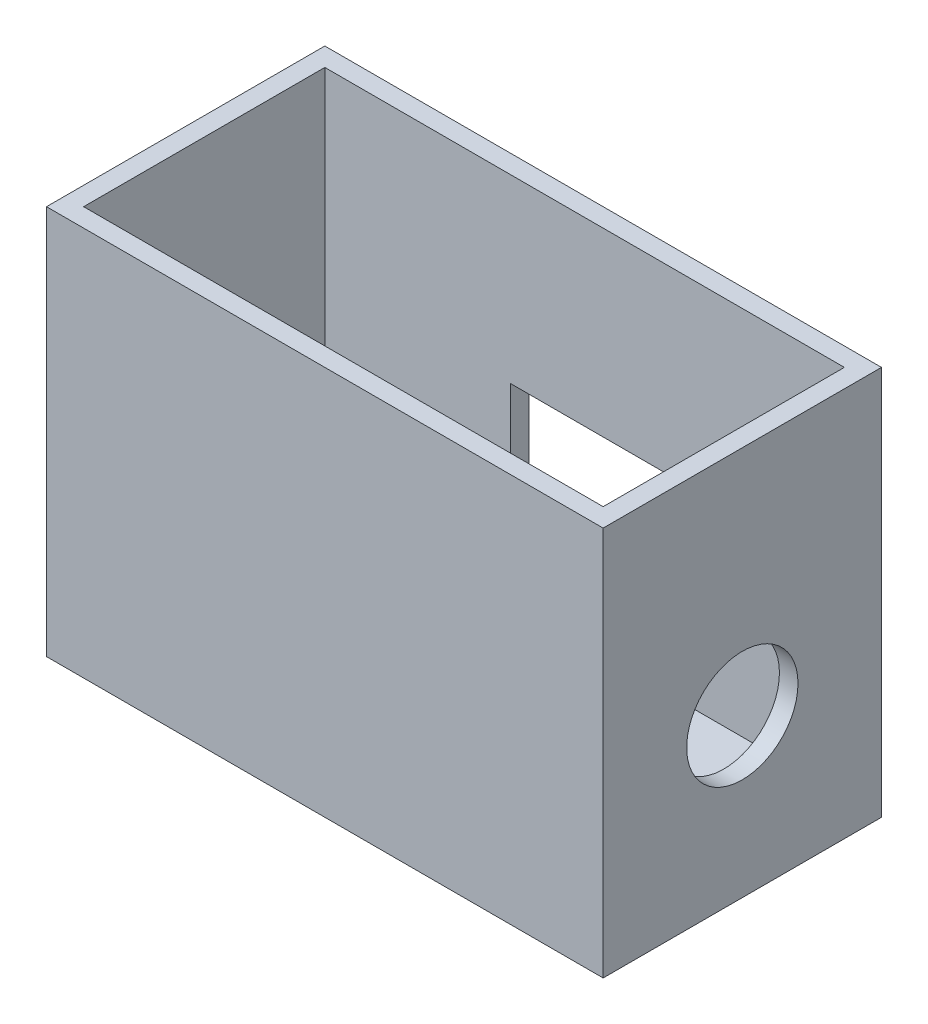
ISO-10303-21;
HEADER;
FILE_DESCRIPTION(('STEP AP214'),'2;1');
FILE_NAME('part.step','',(''),(''),'','','');
FILE_SCHEMA(('AUTOMOTIVE_DESIGN { 1 0 10303 214 1 1 1 1 }'));
ENDSEC;
DATA;
#1=APPLICATION_CONTEXT('core data for automotive mechanical design processes');
#2=APPLICATION_PROTOCOL_DEFINITION('international standard','automotive_design',2000,#1);
#3=PRODUCT_CONTEXT('',#1,'mechanical');
#4=PRODUCT('Part','Part','',(#3));
#5=PRODUCT_RELATED_PRODUCT_CATEGORY('part','',(#4));
#6=PRODUCT_DEFINITION_FORMATION('','',#4);
#7=PRODUCT_DEFINITION_CONTEXT('part definition',#1,'design');
#8=PRODUCT_DEFINITION('design','',#6,#7);
#9=PRODUCT_DEFINITION_SHAPE('','',#8);
#10=(LENGTH_UNIT() NAMED_UNIT(*) SI_UNIT(.MILLI.,.METRE.));
#11=(NAMED_UNIT(*) PLANE_ANGLE_UNIT() SI_UNIT($,.RADIAN.));
#12=(NAMED_UNIT(*) SI_UNIT($,.STERADIAN.) SOLID_ANGLE_UNIT());
#13=UNCERTAINTY_MEASURE_WITH_UNIT(LENGTH_MEASURE(1.E-05),#10,'distance_accuracy_value','');
#14=(GEOMETRIC_REPRESENTATION_CONTEXT(3) GLOBAL_UNCERTAINTY_ASSIGNED_CONTEXT((#13)) GLOBAL_UNIT_ASSIGNED_CONTEXT((#10,
#11,#12)) REPRESENTATION_CONTEXT('',''));
#15=CARTESIAN_POINT('',(0.,0.,0.));
#16=DIRECTION('',(0.,0.,1.));
#17=DIRECTION('',(1.,0.,0.));
#18=AXIS2_PLACEMENT_3D('',#15,#16,#17);
#19=CARTESIAN_POINT('',(0.,42.,2.));
#20=DIRECTION('',(0.,0.,-1.));
#21=DIRECTION('',(-1.,0.,0.));
#22=AXIS2_PLACEMENT_3D('',#19,#20,#21);
#23=PLANE('',#22);
#24=DIRECTION('',(-1.,0.,0.));
#25=VECTOR('',#24,1.);
#26=CARTESIAN_POINT('',(40.,22.5,2.));
#27=LINE('',#26,#25);
#28=CARTESIAN_POINT('',(40.,22.5,2.));
#29=VERTEX_POINT('',#28);
#30=CARTESIAN_POINT('',(22.,22.5,2.));
#31=VERTEX_POINT('',#30);
#32=EDGE_CURVE('E134',#29,#31,#27,.T.);
#33=ORIENTED_EDGE('',*,*,#32,.F.);
#34=DIRECTION('',(0.,1.,0.));
#35=VECTOR('',#34,1.);
#36=CARTESIAN_POINT('',(40.,22.5,2.));
#37=LINE('',#36,#35);
#38=CARTESIAN_POINT('',(40.,10.,2.));
#39=VERTEX_POINT('',#38);
#40=EDGE_CURVE('E136',#39,#29,#37,.T.);
#41=ORIENTED_EDGE('',*,*,#40,.F.);
#42=DIRECTION('',(1.,0.,0.));
#43=VECTOR('',#42,1.);
#44=CARTESIAN_POINT('',(40.,10.,2.));
#45=LINE('',#44,#43);
#46=CARTESIAN_POINT('',(22.,10.,2.));
#47=VERTEX_POINT('',#46);
#48=EDGE_CURVE('E145',#47,#39,#45,.T.);
#49=ORIENTED_EDGE('',*,*,#48,.F.);
#50=DIRECTION('',(0.,-1.,0.));
#51=VECTOR('',#50,1.);
#52=CARTESIAN_POINT('',(22.,22.5,2.));
#53=LINE('',#52,#51);
#54=EDGE_CURVE('E53',#31,#47,#53,.T.);
#55=ORIENTED_EDGE('',*,*,#54,.F.);
#56=EDGE_LOOP('',(#33,#41,#49,#55));
#57=FACE_BOUND('',#56,.T.);
#58=DIRECTION('',(0.,-1.,0.));
#59=VECTOR('',#58,1.);
#60=CARTESIAN_POINT('',(58.,42.,2.));
#61=LINE('',#60,#59);
#62=CARTESIAN_POINT('',(58.,42.,2.));
#63=VERTEX_POINT('',#62);
#64=CARTESIAN_POINT('',(58.,2.,2.));
#65=VERTEX_POINT('',#64);
#66=EDGE_CURVE('E166',#63,#65,#61,.T.);
#67=ORIENTED_EDGE('',*,*,#66,.F.);
#68=DIRECTION('',(1.,0.,0.));
#69=VECTOR('',#68,1.);
#70=CARTESIAN_POINT('',(0.,42.,2.));
#71=LINE('',#70,#69);
#72=CARTESIAN_POINT('',(2.,42.,2.));
#73=VERTEX_POINT('',#72);
#74=EDGE_CURVE('E194',#73,#63,#71,.T.);
#75=ORIENTED_EDGE('',*,*,#74,.F.);
#76=DIRECTION('',(0.,-1.,0.));
#77=VECTOR('',#76,1.);
#78=CARTESIAN_POINT('',(2.,42.,2.));
#79=LINE('',#78,#77);
#80=CARTESIAN_POINT('',(2.,2.,2.));
#81=VERTEX_POINT('',#80);
#82=EDGE_CURVE('E177',#73,#81,#79,.T.);
#83=ORIENTED_EDGE('',*,*,#82,.T.);
#84=DIRECTION('',(1.,0.,0.));
#85=VECTOR('',#84,1.);
#86=CARTESIAN_POINT('',(0.,2.,2.));
#87=LINE('',#86,#85);
#88=EDGE_CURVE('E190',#81,#65,#87,.T.);
#89=ORIENTED_EDGE('',*,*,#88,.T.);
#90=EDGE_LOOP('',(#67,#75,#83,#89));
#91=FACE_BOUND('',#90,.T.);
#92=ADVANCED_FACE('F39',(#57,#91),#23,.F.);
#93=CARTESIAN_POINT('',(0.,42.,28.));
#94=DIRECTION('',(0.,0.,1.));
#95=DIRECTION('',(1.,0.,0.));
#96=AXIS2_PLACEMENT_3D('',#93,#94,#95);
#97=PLANE('',#96);
#98=DIRECTION('',(-1.,0.,0.));
#99=VECTOR('',#98,1.);
#100=CARTESIAN_POINT('',(0.,42.,28.));
#101=LINE('',#100,#99);
#102=CARTESIAN_POINT('',(58.,42.,28.));
#103=VERTEX_POINT('',#102);
#104=CARTESIAN_POINT('',(2.,42.,28.));
#105=VERTEX_POINT('',#104);
#106=EDGE_CURVE('E189',#103,#105,#101,.T.);
#107=ORIENTED_EDGE('',*,*,#106,.F.);
#108=DIRECTION('',(0.,-1.,0.));
#109=VECTOR('',#108,1.);
#110=CARTESIAN_POINT('',(58.,42.,28.));
#111=LINE('',#110,#109);
#112=CARTESIAN_POINT('',(58.,2.,28.));
#113=VERTEX_POINT('',#112);
#114=EDGE_CURVE('E164',#103,#113,#111,.T.);
#115=ORIENTED_EDGE('',*,*,#114,.T.);
#116=DIRECTION('',(-1.,0.,0.));
#117=VECTOR('',#116,1.);
#118=CARTESIAN_POINT('',(0.,2.,28.));
#119=LINE('',#118,#117);
#120=CARTESIAN_POINT('',(2.,2.,28.));
#121=VERTEX_POINT('',#120);
#122=EDGE_CURVE('E181',#113,#121,#119,.T.);
#123=ORIENTED_EDGE('',*,*,#122,.T.);
#124=DIRECTION('',(0.,-1.,0.));
#125=VECTOR('',#124,1.);
#126=CARTESIAN_POINT('',(2.,42.,28.));
#127=LINE('',#126,#125);
#128=EDGE_CURVE('E178',#105,#121,#127,.T.);
#129=ORIENTED_EDGE('',*,*,#128,.F.);
#130=EDGE_LOOP('',(#107,#115,#123,#129));
#131=FACE_BOUND('',#130,.T.);
#132=ADVANCED_FACE('F241',(#131),#97,.F.);
#133=CARTESIAN_POINT('',(0.,2.,0.));
#134=DIRECTION('',(1.,0.,0.));
#135=DIRECTION('',(0.,0.,-1.));
#136=AXIS2_PLACEMENT_3D('',#133,#134,#135);
#137=PLANE('',#136);
#138=DIRECTION('',(0.,-1.,0.));
#139=VECTOR('',#138,1.);
#140=CARTESIAN_POINT('',(0.,2.,30.));
#141=LINE('',#140,#139);
#142=CARTESIAN_POINT('',(0.,42.,30.));
#143=VERTEX_POINT('',#142);
#144=CARTESIAN_POINT('',(0.,0.,30.));
#145=VERTEX_POINT('',#144);
#146=EDGE_CURVE('E11',#143,#145,#141,.T.);
#147=ORIENTED_EDGE('',*,*,#146,.F.);
#148=DIRECTION('',(0.,0.,1.));
#149=VECTOR('',#148,1.);
#150=CARTESIAN_POINT('',(0.,42.,0.));
#151=LINE('',#150,#149);
#152=CARTESIAN_POINT('',(0.,42.,0.));
#153=VERTEX_POINT('',#152);
#154=EDGE_CURVE('E192',#153,#143,#151,.T.);
#155=ORIENTED_EDGE('',*,*,#154,.F.);
#156=DIRECTION('',(0.,-1.,0.));
#157=VECTOR('',#156,1.);
#158=CARTESIAN_POINT('',(0.,2.,0.));
#159=LINE('',#158,#157);
#160=CARTESIAN_POINT('',(0.,0.,0.));
#161=VERTEX_POINT('',#160);
#162=EDGE_CURVE('E211',#153,#161,#159,.T.);
#163=ORIENTED_EDGE('',*,*,#162,.T.);
#164=DIRECTION('',(0.,0.,1.));
#165=VECTOR('',#164,1.);
#166=CARTESIAN_POINT('',(0.,0.,0.));
#167=LINE('',#166,#165);
#168=EDGE_CURVE('E203',#161,#145,#167,.T.);
#169=ORIENTED_EDGE('',*,*,#168,.T.);
#170=EDGE_LOOP('',(#147,#155,#163,#169));
#171=FACE_BOUND('',#170,.T.);
#172=ADVANCED_FACE('F41',(#171),#137,.F.);
#173=CARTESIAN_POINT('',(0.,2.,30.));
#174=DIRECTION('',(0.,0.,-1.));
#175=DIRECTION('',(-1.,0.,0.));
#176=AXIS2_PLACEMENT_3D('',#173,#174,#175);
#177=PLANE('',#176);
#178=DIRECTION('',(1.,0.,0.));
#179=VECTOR('',#178,1.);
#180=CARTESIAN_POINT('',(0.,0.,30.));
#181=LINE('',#180,#179);
#182=CARTESIAN_POINT('',(60.,0.,30.));
#183=VERTEX_POINT('',#182);
#184=EDGE_CURVE('E202',#145,#183,#181,.T.);
#185=ORIENTED_EDGE('',*,*,#184,.T.);
#186=DIRECTION('',(0.,-1.,0.));
#187=VECTOR('',#186,1.);
#188=CARTESIAN_POINT('',(60.,2.,30.));
#189=LINE('',#188,#187);
#190=CARTESIAN_POINT('',(60.,42.,30.));
#191=VERTEX_POINT('',#190);
#192=EDGE_CURVE('E50',#191,#183,#189,.T.);
#193=ORIENTED_EDGE('',*,*,#192,.F.);
#194=DIRECTION('',(1.,0.,0.));
#195=VECTOR('',#194,1.);
#196=CARTESIAN_POINT('',(0.,42.,30.));
#197=LINE('',#196,#195);
#198=EDGE_CURVE('E184',#143,#191,#197,.T.);
#199=ORIENTED_EDGE('',*,*,#198,.F.);
#200=ORIENTED_EDGE('',*,*,#146,.T.);
#201=EDGE_LOOP('',(#185,#193,#199,#200));
#202=FACE_BOUND('',#201,.T.);
#203=ADVANCED_FACE('F237',(#202),#177,.F.);
#204=CARTESIAN_POINT('',(60.,2.,0.));
#205=DIRECTION('',(-1.,0.,0.));
#206=DIRECTION('',(0.,0.,1.));
#207=AXIS2_PLACEMENT_3D('',#204,#205,#206);
#208=PLANE('',#207);
#209=CARTESIAN_POINT('',(60.,17.,15.));
#210=DIRECTION('',(1.,0.,0.));
#211=DIRECTION('',(0.,0.,-1.));
#212=AXIS2_PLACEMENT_3D('',#209,#210,#211);
#213=CIRCLE('',#212,6.);
#214=CARTESIAN_POINT('',(60.,17.,9.));
#215=VERTEX_POINT('',#214);
#216=EDGE_CURVE('E158',#215,#215,#213,.T.);
#217=ORIENTED_EDGE('',*,*,#216,.F.);
#218=EDGE_LOOP('',(#217));
#219=FACE_BOUND('',#218,.T.);
#220=DIRECTION('',(0.,0.,-1.));
#221=VECTOR('',#220,1.);
#222=CARTESIAN_POINT('',(60.,0.,0.));
#223=LINE('',#222,#221);
#224=CARTESIAN_POINT('',(60.,0.,0.));
#225=VERTEX_POINT('',#224);
#226=EDGE_CURVE('E210',#183,#225,#223,.T.);
#227=ORIENTED_EDGE('',*,*,#226,.T.);
#228=DIRECTION('',(0.,-1.,0.));
#229=VECTOR('',#228,1.);
#230=CARTESIAN_POINT('',(60.,2.,0.));
#231=LINE('',#230,#229);
#232=CARTESIAN_POINT('',(60.,42.,0.));
#233=VERTEX_POINT('',#232);
#234=EDGE_CURVE('E212',#233,#225,#231,.T.);
#235=ORIENTED_EDGE('',*,*,#234,.F.);
#236=DIRECTION('',(0.,0.,1.));
#237=VECTOR('',#236,1.);
#238=CARTESIAN_POINT('',(60.,42.,0.));
#239=LINE('',#238,#237);
#240=EDGE_CURVE('E198',#233,#191,#239,.T.);
#241=ORIENTED_EDGE('',*,*,#240,.T.);
#242=ORIENTED_EDGE('',*,*,#192,.T.);
#243=EDGE_LOOP('',(#227,#235,#241,#242));
#244=FACE_BOUND('',#243,.T.);
#245=ADVANCED_FACE('F219',(#219,#244),#208,.F.);
#246=CARTESIAN_POINT('',(0.,2.,0.));
#247=DIRECTION('',(0.,0.,1.));
#248=DIRECTION('',(1.,0.,0.));
#249=AXIS2_PLACEMENT_3D('',#246,#247,#248);
#250=PLANE('',#249);
#251=DIRECTION('',(-1.,0.,0.));
#252=VECTOR('',#251,1.);
#253=CARTESIAN_POINT('',(40.,10.,0.));
#254=LINE('',#253,#252);
#255=CARTESIAN_POINT('',(40.,10.,0.));
#256=VERTEX_POINT('',#255);
#257=CARTESIAN_POINT('',(22.,10.,0.));
#258=VERTEX_POINT('',#257);
#259=EDGE_CURVE('E267',#256,#258,#254,.T.);
#260=ORIENTED_EDGE('',*,*,#259,.F.);
#261=DIRECTION('',(0.,-1.,0.));
#262=VECTOR('',#261,1.);
#263=CARTESIAN_POINT('',(40.,22.5,0.));
#264=LINE('',#263,#262);
#265=CARTESIAN_POINT('',(40.,22.5,0.));
#266=VERTEX_POINT('',#265);
#267=EDGE_CURVE('E64',#266,#256,#264,.T.);
#268=ORIENTED_EDGE('',*,*,#267,.F.);
#269=DIRECTION('',(1.,0.,0.));
#270=VECTOR('',#269,1.);
#271=CARTESIAN_POINT('',(40.,22.5,0.));
#272=LINE('',#271,#270);
#273=CARTESIAN_POINT('',(22.,22.5,0.));
#274=VERTEX_POINT('',#273);
#275=EDGE_CURVE('E135',#274,#266,#272,.T.);
#276=ORIENTED_EDGE('',*,*,#275,.F.);
#277=DIRECTION('',(0.,1.,0.));
#278=VECTOR('',#277,1.);
#279=CARTESIAN_POINT('',(22.,22.5,0.));
#280=LINE('',#279,#278);
#281=EDGE_CURVE('E271',#258,#274,#280,.T.);
#282=ORIENTED_EDGE('',*,*,#281,.F.);
#283=EDGE_LOOP('',(#260,#268,#276,#282));
#284=FACE_BOUND('',#283,.T.);
#285=DIRECTION('',(-1.,0.,0.));
#286=VECTOR('',#285,1.);
#287=CARTESIAN_POINT('',(0.,0.,0.));
#288=LINE('',#287,#286);
#289=EDGE_CURVE('E207',#225,#161,#288,.T.);
#290=ORIENTED_EDGE('',*,*,#289,.T.);
#291=ORIENTED_EDGE('',*,*,#162,.F.);
#292=DIRECTION('',(1.,0.,0.));
#293=VECTOR('',#292,1.);
#294=CARTESIAN_POINT('',(0.,42.,0.));
#295=LINE('',#294,#293);
#296=EDGE_CURVE('E196',#153,#233,#295,.T.);
#297=ORIENTED_EDGE('',*,*,#296,.T.);
#298=ORIENTED_EDGE('',*,*,#234,.T.);
#299=EDGE_LOOP('',(#290,#291,#297,#298));
#300=FACE_BOUND('',#299,.T.);
#301=ADVANCED_FACE('F230',(#284,#300),#250,.F.);
#302=CARTESIAN_POINT('',(0.,2.,0.));
#303=DIRECTION('',(0.,1.,0.));
#304=DIRECTION('',(0.,0.,1.));
#305=AXIS2_PLACEMENT_3D('',#302,#303,#304);
#306=PLANE('',#305);
#307=DIRECTION('',(0.,0.,1.));
#308=VECTOR('',#307,1.);
#309=CARTESIAN_POINT('',(58.,2.,2.));
#310=LINE('',#309,#308);
#311=EDGE_CURVE('E161',#65,#113,#310,.T.);
#312=ORIENTED_EDGE('',*,*,#311,.F.);
#313=ORIENTED_EDGE('',*,*,#88,.F.);
#314=DIRECTION('',(0.,0.,-1.));
#315=VECTOR('',#314,1.);
#316=CARTESIAN_POINT('',(2.,2.,2.));
#317=LINE('',#316,#315);
#318=EDGE_CURVE('E174',#121,#81,#317,.T.);
#319=ORIENTED_EDGE('',*,*,#318,.F.);
#320=ORIENTED_EDGE('',*,*,#122,.F.);
#321=EDGE_LOOP('',(#312,#313,#319,#320));
#322=FACE_BOUND('',#321,.T.);
#323=ADVANCED_FACE('F260',(#322),#306,.T.);
#324=CARTESIAN_POINT('',(0.,0.,0.));
#325=DIRECTION('',(0.,1.,0.));
#326=DIRECTION('',(0.,0.,1.));
#327=AXIS2_PLACEMENT_3D('',#324,#325,#326);
#328=PLANE('',#327);
#329=ORIENTED_EDGE('',*,*,#168,.F.);
#330=ORIENTED_EDGE('',*,*,#289,.F.);
#331=ORIENTED_EDGE('',*,*,#226,.F.);
#332=ORIENTED_EDGE('',*,*,#184,.F.);
#333=EDGE_LOOP('',(#329,#330,#331,#332));
#334=FACE_BOUND('',#333,.T.);
#335=ADVANCED_FACE('F229',(#334),#328,.F.);
#336=CARTESIAN_POINT('',(0.,42.,0.));
#337=DIRECTION('',(0.,1.,0.));
#338=DIRECTION('',(0.,0.,1.));
#339=AXIS2_PLACEMENT_3D('',#336,#337,#338);
#340=PLANE('',#339);
#341=DIRECTION('',(0.,0.,1.));
#342=VECTOR('',#341,1.);
#343=CARTESIAN_POINT('',(58.,42.,2.));
#344=LINE('',#343,#342);
#345=EDGE_CURVE('E165',#63,#103,#344,.T.);
#346=ORIENTED_EDGE('',*,*,#345,.T.);
#347=ORIENTED_EDGE('',*,*,#106,.T.);
#348=DIRECTION('',(0.,0.,-1.));
#349=VECTOR('',#348,1.);
#350=CARTESIAN_POINT('',(2.,42.,2.));
#351=LINE('',#350,#349);
#352=EDGE_CURVE('E172',#105,#73,#351,.T.);
#353=ORIENTED_EDGE('',*,*,#352,.T.);
#354=ORIENTED_EDGE('',*,*,#74,.T.);
#355=EDGE_LOOP('',(#346,#347,#353,#354));
#356=FACE_BOUND('',#355,.T.);
#357=ORIENTED_EDGE('',*,*,#154,.T.);
#358=ORIENTED_EDGE('',*,*,#198,.T.);
#359=ORIENTED_EDGE('',*,*,#240,.F.);
#360=ORIENTED_EDGE('',*,*,#296,.F.);
#361=EDGE_LOOP('',(#357,#358,#359,#360));
#362=FACE_BOUND('',#361,.T.);
#363=ADVANCED_FACE('F233',(#356,#362),#340,.T.);
#364=CARTESIAN_POINT('',(2.,42.,2.));
#365=DIRECTION('',(-1.,0.,0.));
#366=DIRECTION('',(0.,0.,1.));
#367=AXIS2_PLACEMENT_3D('',#364,#365,#366);
#368=PLANE('',#367);
#369=ORIENTED_EDGE('',*,*,#318,.T.);
#370=ORIENTED_EDGE('',*,*,#82,.F.);
#371=ORIENTED_EDGE('',*,*,#352,.F.);
#372=ORIENTED_EDGE('',*,*,#128,.T.);
#373=EDGE_LOOP('',(#369,#370,#371,#372));
#374=FACE_BOUND('',#373,.T.);
#375=ADVANCED_FACE('F293',(#374),#368,.F.);
#376=CARTESIAN_POINT('',(58.,42.,2.));
#377=DIRECTION('',(1.,0.,0.));
#378=DIRECTION('',(0.,0.,-1.));
#379=AXIS2_PLACEMENT_3D('',#376,#377,#378);
#380=PLANE('',#379);
#381=CARTESIAN_POINT('',(58.,17.,15.));
#382=DIRECTION('',(1.,0.,0.));
#383=DIRECTION('',(0.,0.,-1.));
#384=AXIS2_PLACEMENT_3D('',#381,#382,#383);
#385=CIRCLE('',#384,6.);
#386=CARTESIAN_POINT('',(58.,17.,9.));
#387=VERTEX_POINT('',#386);
#388=EDGE_CURVE('E146',#387,#387,#385,.F.);
#389=ORIENTED_EDGE('',*,*,#388,.F.);
#390=EDGE_LOOP('',(#389));
#391=FACE_BOUND('',#390,.T.);
#392=ORIENTED_EDGE('',*,*,#311,.T.);
#393=ORIENTED_EDGE('',*,*,#114,.F.);
#394=ORIENTED_EDGE('',*,*,#345,.F.);
#395=ORIENTED_EDGE('',*,*,#66,.T.);
#396=EDGE_LOOP('',(#392,#393,#394,#395));
#397=FACE_BOUND('',#396,.T.);
#398=ADVANCED_FACE('F292',(#391,#397),#380,.F.);
#399=CARTESIAN_POINT('',(-0.00100000000000794,17.,15.));
#400=DIRECTION('',(1.,0.,0.));
#401=DIRECTION('',(0.,0.,-1.));
#402=AXIS2_PLACEMENT_3D('',#399,#400,#401);
#403=CYLINDRICAL_SURFACE('',#402,6.);
#404=ORIENTED_EDGE('',*,*,#216,.T.);
#405=EDGE_LOOP('',(#404));
#406=FACE_BOUND('',#405,.T.);
#407=ORIENTED_EDGE('',*,*,#388,.T.);
#408=EDGE_LOOP('',(#407));
#409=FACE_BOUND('',#408,.T.);
#410=ADVANCED_FACE('F286',(#406,#409),#403,.F.);
#411=CARTESIAN_POINT('',(40.,22.5,30.001));
#412=DIRECTION('',(1.,0.,0.));
#413=DIRECTION('',(0.,0.,-1.));
#414=AXIS2_PLACEMENT_3D('',#411,#412,#413);
#415=PLANE('',#414);
#416=ORIENTED_EDGE('',*,*,#40,.T.);
#417=DIRECTION('',(0.,0.,-1.));
#418=VECTOR('',#417,1.);
#419=CARTESIAN_POINT('',(40.,22.5,30.001));
#420=LINE('',#419,#418);
#421=EDGE_CURVE('E126',#29,#266,#420,.T.);
#422=ORIENTED_EDGE('',*,*,#421,.T.);
#423=ORIENTED_EDGE('',*,*,#267,.T.);
#424=DIRECTION('',(0.,0.,-1.));
#425=VECTOR('',#424,1.);
#426=CARTESIAN_POINT('',(40.,10.,30.001));
#427=LINE('',#426,#425);
#428=EDGE_CURVE('E137',#39,#256,#427,.T.);
#429=ORIENTED_EDGE('',*,*,#428,.F.);
#430=EDGE_LOOP('',(#416,#422,#423,#429));
#431=FACE_BOUND('',#430,.T.);
#432=ADVANCED_FACE('F138',(#431),#415,.F.);
#433=CARTESIAN_POINT('',(40.,22.5,30.001));
#434=DIRECTION('',(0.,1.,0.));
#435=DIRECTION('',(0.,0.,1.));
#436=AXIS2_PLACEMENT_3D('',#433,#434,#435);
#437=PLANE('',#436);
#438=ORIENTED_EDGE('',*,*,#32,.T.);
#439=DIRECTION('',(0.,0.,-1.));
#440=VECTOR('',#439,1.);
#441=CARTESIAN_POINT('',(22.,22.5,30.001));
#442=LINE('',#441,#440);
#443=EDGE_CURVE('E131',#31,#274,#442,.T.);
#444=ORIENTED_EDGE('',*,*,#443,.T.);
#445=ORIENTED_EDGE('',*,*,#275,.T.);
#446=ORIENTED_EDGE('',*,*,#421,.F.);
#447=EDGE_LOOP('',(#438,#444,#445,#446));
#448=FACE_BOUND('',#447,.T.);
#449=ADVANCED_FACE('F128',(#448),#437,.F.);
#450=CARTESIAN_POINT('',(22.,22.5,30.001));
#451=DIRECTION('',(-1.,0.,0.));
#452=DIRECTION('',(0.,-1.,0.));
#453=AXIS2_PLACEMENT_3D('',#450,#451,#452);
#454=PLANE('',#453);
#455=ORIENTED_EDGE('',*,*,#54,.T.);
#456=DIRECTION('',(0.,0.,-1.));
#457=VECTOR('',#456,1.);
#458=CARTESIAN_POINT('',(22.,10.,30.001));
#459=LINE('',#458,#457);
#460=EDGE_CURVE('E153',#47,#258,#459,.T.);
#461=ORIENTED_EDGE('',*,*,#460,.T.);
#462=ORIENTED_EDGE('',*,*,#281,.T.);
#463=ORIENTED_EDGE('',*,*,#443,.F.);
#464=EDGE_LOOP('',(#455,#461,#462,#463));
#465=FACE_BOUND('',#464,.T.);
#466=ADVANCED_FACE('F279',(#465),#454,.F.);
#467=CARTESIAN_POINT('',(40.,10.,30.001));
#468=DIRECTION('',(0.,-1.,0.));
#469=DIRECTION('',(0.,0.,-1.));
#470=AXIS2_PLACEMENT_3D('',#467,#468,#469);
#471=PLANE('',#470);
#472=ORIENTED_EDGE('',*,*,#48,.T.);
#473=ORIENTED_EDGE('',*,*,#428,.T.);
#474=ORIENTED_EDGE('',*,*,#259,.T.);
#475=ORIENTED_EDGE('',*,*,#460,.F.);
#476=EDGE_LOOP('',(#472,#473,#474,#475));
#477=FACE_BOUND('',#476,.T.);
#478=ADVANCED_FACE('F280',(#477),#471,.F.);
#479=CLOSED_SHELL('',(#92,#132,#172,#203,#245,#301,#323,#335,#363,#375,#398,#410,#432,#449,#466,#478));
#480=MANIFOLD_SOLID_BREP('B2',#479);
#481=ADVANCED_BREP_SHAPE_REPRESENTATION('',(#18,#480),#14);
#482=SHAPE_DEFINITION_REPRESENTATION(#9,#481);
ENDSEC;
END-ISO-10303-21;
